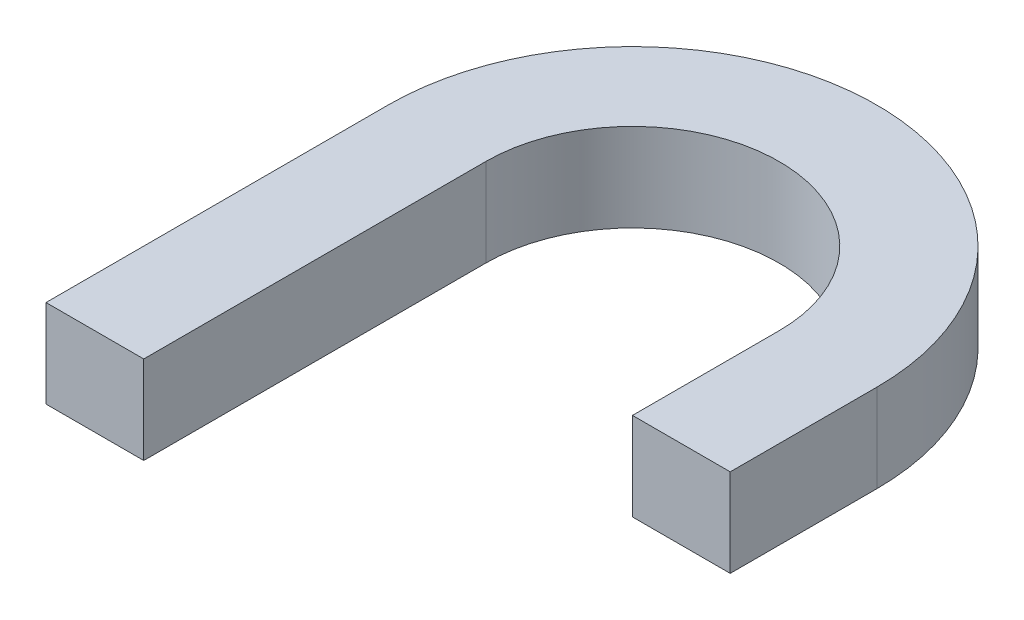
ISO-10303-21;
HEADER;
FILE_DESCRIPTION(('STEP AP214'),'2;1');
FILE_NAME('part.step','',(''),(''),'','','');
FILE_SCHEMA(('AUTOMOTIVE_DESIGN { 1 0 10303 214 1 1 1 1 }'));
ENDSEC;
DATA;
#1=APPLICATION_CONTEXT('core data for automotive mechanical design processes');
#2=APPLICATION_PROTOCOL_DEFINITION('international standard','automotive_design',2000,#1);
#3=PRODUCT_CONTEXT('',#1,'mechanical');
#4=PRODUCT('Part','Part','',(#3));
#5=PRODUCT_RELATED_PRODUCT_CATEGORY('part','',(#4));
#6=PRODUCT_DEFINITION_FORMATION('','',#4);
#7=PRODUCT_DEFINITION_CONTEXT('part definition',#1,'design');
#8=PRODUCT_DEFINITION('design','',#6,#7);
#9=PRODUCT_DEFINITION_SHAPE('','',#8);
#10=(LENGTH_UNIT() NAMED_UNIT(*) SI_UNIT(.MILLI.,.METRE.));
#11=(NAMED_UNIT(*) PLANE_ANGLE_UNIT() SI_UNIT($,.RADIAN.));
#12=(NAMED_UNIT(*) SI_UNIT($,.STERADIAN.) SOLID_ANGLE_UNIT());
#13=UNCERTAINTY_MEASURE_WITH_UNIT(LENGTH_MEASURE(1.E-05),#10,'distance_accuracy_value','');
#14=(GEOMETRIC_REPRESENTATION_CONTEXT(3) GLOBAL_UNCERTAINTY_ASSIGNED_CONTEXT((#13)) GLOBAL_UNIT_ASSIGNED_CONTEXT((#10,
#11,#12)) REPRESENTATION_CONTEXT('',''));
#15=CARTESIAN_POINT('',(0.,0.,0.));
#16=DIRECTION('',(0.,0.,1.));
#17=DIRECTION('',(1.,0.,0.));
#18=AXIS2_PLACEMENT_3D('',#15,#16,#17);
#19=CARTESIAN_POINT('',(0.,11.43,0.));
#20=DIRECTION('',(0.,-1.,0.));
#21=DIRECTION('',(0.,0.,-1.));
#22=AXIS2_PLACEMENT_3D('',#19,#20,#21);
#23=CYLINDRICAL_SURFACE('',#22,63.5);
#24=CARTESIAN_POINT('',(0.,-11.43,0.));
#25=DIRECTION('',(0.,1.,0.));
#26=DIRECTION('',(0.,0.,1.));
#27=AXIS2_PLACEMENT_3D('',#24,#25,#26);
#28=CIRCLE('',#27,63.5);
#29=CARTESIAN_POINT('',(63.5,-11.43,0.));
#30=VERTEX_POINT('',#29);
#31=CARTESIAN_POINT('',(-63.5,-11.43,0.));
#32=VERTEX_POINT('',#31);
#33=EDGE_CURVE('E158',#30,#32,#28,.T.);
#34=ORIENTED_EDGE('',*,*,#33,.T.);
#35=DIRECTION('',(0.,-1.,0.));
#36=VECTOR('',#35,1.);
#37=CARTESIAN_POINT('',(-63.5,11.43,0.));
#38=LINE('',#37,#36);
#39=CARTESIAN_POINT('',(-63.5,11.43,0.));
#40=VERTEX_POINT('',#39);
#41=EDGE_CURVE('E11',#40,#32,#38,.T.);
#42=ORIENTED_EDGE('',*,*,#41,.F.);
#43=CARTESIAN_POINT('',(0.,11.43,0.));
#44=DIRECTION('',(0.,1.,0.));
#45=DIRECTION('',(0.,0.,1.));
#46=AXIS2_PLACEMENT_3D('',#43,#44,#45);
#47=CIRCLE('',#46,63.5);
#48=CARTESIAN_POINT('',(63.5,11.43,0.));
#49=VERTEX_POINT('',#48);
#50=EDGE_CURVE('E179',#49,#40,#47,.T.);
#51=ORIENTED_EDGE('',*,*,#50,.F.);
#52=DIRECTION('',(0.,-1.,0.));
#53=VECTOR('',#52,1.);
#54=CARTESIAN_POINT('',(63.5,11.43,0.));
#55=LINE('',#54,#53);
#56=EDGE_CURVE('E154',#49,#30,#55,.T.);
#57=ORIENTED_EDGE('',*,*,#56,.T.);
#58=EDGE_LOOP('',(#34,#42,#51,#57));
#59=FACE_BOUND('',#58,.T.);
#60=ADVANCED_FACE('F40',(#59),#23,.T.);
#61=CARTESIAN_POINT('',(-63.5,11.43,0.));
#62=DIRECTION('',(1.,0.,0.));
#63=DIRECTION('',(0.,0.,-1.));
#64=AXIS2_PLACEMENT_3D('',#61,#62,#63);
#65=PLANE('',#64);
#66=DIRECTION('',(0.,0.,1.));
#67=VECTOR('',#66,1.);
#68=CARTESIAN_POINT('',(-63.5,-11.43,0.));
#69=LINE('',#68,#67);
#70=CARTESIAN_POINT('',(-63.5,-11.43,88.9));
#71=VERTEX_POINT('',#70);
#72=EDGE_CURVE('E162',#32,#71,#69,.T.);
#73=ORIENTED_EDGE('',*,*,#72,.T.);
#74=DIRECTION('',(0.,-1.,0.));
#75=VECTOR('',#74,1.);
#76=CARTESIAN_POINT('',(-63.5,11.43,88.9));
#77=LINE('',#76,#75);
#78=CARTESIAN_POINT('',(-63.5,11.43,88.9));
#79=VERTEX_POINT('',#78);
#80=EDGE_CURVE('E49',#79,#71,#77,.T.);
#81=ORIENTED_EDGE('',*,*,#80,.F.);
#82=DIRECTION('',(0.,0.,1.));
#83=VECTOR('',#82,1.);
#84=CARTESIAN_POINT('',(-63.5,11.43,0.));
#85=LINE('',#84,#83);
#86=EDGE_CURVE('E112',#40,#79,#85,.T.);
#87=ORIENTED_EDGE('',*,*,#86,.F.);
#88=ORIENTED_EDGE('',*,*,#41,.T.);
#89=EDGE_LOOP('',(#73,#81,#87,#88));
#90=FACE_BOUND('',#89,.T.);
#91=ADVANCED_FACE('F225',(#90),#65,.F.);
#92=CARTESIAN_POINT('',(-63.5,11.43,88.9));
#93=DIRECTION('',(0.,0.,-1.));
#94=DIRECTION('',(-1.,0.,0.));
#95=AXIS2_PLACEMENT_3D('',#92,#93,#94);
#96=PLANE('',#95);
#97=DIRECTION('',(1.,0.,0.));
#98=VECTOR('',#97,1.);
#99=CARTESIAN_POINT('',(-63.5,-11.43,88.9));
#100=LINE('',#99,#98);
#101=CARTESIAN_POINT('',(-38.1,-11.43,88.9));
#102=VERTEX_POINT('',#101);
#103=EDGE_CURVE('E165',#71,#102,#100,.T.);
#104=ORIENTED_EDGE('',*,*,#103,.T.);
#105=DIRECTION('',(0.,-1.,0.));
#106=VECTOR('',#105,1.);
#107=CARTESIAN_POINT('',(-38.1,11.43,88.9));
#108=LINE('',#107,#106);
#109=CARTESIAN_POINT('',(-38.1,11.43,88.9));
#110=VERTEX_POINT('',#109);
#111=EDGE_CURVE('E190',#110,#102,#108,.T.);
#112=ORIENTED_EDGE('',*,*,#111,.F.);
#113=DIRECTION('',(1.,0.,0.));
#114=VECTOR('',#113,1.);
#115=CARTESIAN_POINT('',(-63.5,11.43,88.9));
#116=LINE('',#115,#114);
#117=EDGE_CURVE('E200',#79,#110,#116,.T.);
#118=ORIENTED_EDGE('',*,*,#117,.F.);
#119=ORIENTED_EDGE('',*,*,#80,.T.);
#120=EDGE_LOOP('',(#104,#112,#118,#119));
#121=FACE_BOUND('',#120,.T.);
#122=ADVANCED_FACE('F198',(#121),#96,.F.);
#123=CARTESIAN_POINT('',(-38.1,11.43,0.));
#124=DIRECTION('',(-1.,0.,0.));
#125=DIRECTION('',(0.,0.,1.));
#126=AXIS2_PLACEMENT_3D('',#123,#124,#125);
#127=PLANE('',#126);
#128=DIRECTION('',(0.,0.,-1.));
#129=VECTOR('',#128,1.);
#130=CARTESIAN_POINT('',(-38.1,-11.43,0.));
#131=LINE('',#130,#129);
#132=CARTESIAN_POINT('',(-38.1,-11.43,0.));
#133=VERTEX_POINT('',#132);
#134=EDGE_CURVE('E168',#102,#133,#131,.T.);
#135=ORIENTED_EDGE('',*,*,#134,.T.);
#136=DIRECTION('',(0.,-1.,0.));
#137=VECTOR('',#136,1.);
#138=CARTESIAN_POINT('',(-38.1,11.43,0.));
#139=LINE('',#138,#137);
#140=CARTESIAN_POINT('',(-38.1,11.43,0.));
#141=VERTEX_POINT('',#140);
#142=EDGE_CURVE('E186',#141,#133,#139,.T.);
#143=ORIENTED_EDGE('',*,*,#142,.F.);
#144=DIRECTION('',(0.,0.,-1.));
#145=VECTOR('',#144,1.);
#146=CARTESIAN_POINT('',(-38.1,11.43,0.));
#147=LINE('',#146,#145);
#148=EDGE_CURVE('E213',#110,#141,#147,.T.);
#149=ORIENTED_EDGE('',*,*,#148,.F.);
#150=ORIENTED_EDGE('',*,*,#111,.T.);
#151=EDGE_LOOP('',(#135,#143,#149,#150));
#152=FACE_BOUND('',#151,.T.);
#153=ADVANCED_FACE('F208',(#152),#127,.F.);
#154=CARTESIAN_POINT('',(0.,11.43,0.));
#155=DIRECTION('',(0.,-1.,0.));
#156=DIRECTION('',(0.,0.,-1.));
#157=AXIS2_PLACEMENT_3D('',#154,#155,#156);
#158=CYLINDRICAL_SURFACE('',#157,38.1);
#159=CARTESIAN_POINT('',(0.,-11.43,0.));
#160=DIRECTION('',(0.,-1.,0.));
#161=DIRECTION('',(0.,0.,1.));
#162=AXIS2_PLACEMENT_3D('',#159,#160,#161);
#163=CIRCLE('',#162,38.1);
#164=CARTESIAN_POINT('',(38.1,-11.43,0.));
#165=VERTEX_POINT('',#164);
#166=EDGE_CURVE('E171',#133,#165,#163,.T.);
#167=ORIENTED_EDGE('',*,*,#166,.T.);
#168=DIRECTION('',(0.,-1.,0.));
#169=VECTOR('',#168,1.);
#170=CARTESIAN_POINT('',(38.1,11.43,0.));
#171=LINE('',#170,#169);
#172=CARTESIAN_POINT('',(38.1,11.43,0.));
#173=VERTEX_POINT('',#172);
#174=EDGE_CURVE('E146',#173,#165,#171,.T.);
#175=ORIENTED_EDGE('',*,*,#174,.F.);
#176=CARTESIAN_POINT('',(0.,11.43,0.));
#177=DIRECTION('',(0.,-1.,0.));
#178=DIRECTION('',(0.,0.,1.));
#179=AXIS2_PLACEMENT_3D('',#176,#177,#178);
#180=CIRCLE('',#179,38.1);
#181=EDGE_CURVE('E135',#141,#173,#180,.T.);
#182=ORIENTED_EDGE('',*,*,#181,.F.);
#183=ORIENTED_EDGE('',*,*,#142,.T.);
#184=EDGE_LOOP('',(#167,#175,#182,#183));
#185=FACE_BOUND('',#184,.T.);
#186=ADVANCED_FACE('F211',(#185),#158,.F.);
#187=CARTESIAN_POINT('',(38.1,11.43,38.1));
#188=DIRECTION('',(1.,0.,0.));
#189=DIRECTION('',(0.,0.,-1.));
#190=AXIS2_PLACEMENT_3D('',#187,#188,#189);
#191=PLANE('',#190);
#192=DIRECTION('',(0.,0.,1.));
#193=VECTOR('',#192,1.);
#194=CARTESIAN_POINT('',(38.1,-11.43,38.1));
#195=LINE('',#194,#193);
#196=CARTESIAN_POINT('',(38.1,-11.43,38.1));
#197=VERTEX_POINT('',#196);
#198=EDGE_CURVE('E144',#165,#197,#195,.T.);
#199=ORIENTED_EDGE('',*,*,#198,.T.);
#200=DIRECTION('',(0.,-1.,0.));
#201=VECTOR('',#200,1.);
#202=CARTESIAN_POINT('',(38.1,11.43,38.1));
#203=LINE('',#202,#201);
#204=CARTESIAN_POINT('',(38.1,11.43,38.1));
#205=VERTEX_POINT('',#204);
#206=EDGE_CURVE('E141',#205,#197,#203,.T.);
#207=ORIENTED_EDGE('',*,*,#206,.F.);
#208=DIRECTION('',(0.,0.,1.));
#209=VECTOR('',#208,1.);
#210=CARTESIAN_POINT('',(38.1,11.43,38.1));
#211=LINE('',#210,#209);
#212=EDGE_CURVE('E129',#173,#205,#211,.T.);
#213=ORIENTED_EDGE('',*,*,#212,.F.);
#214=ORIENTED_EDGE('',*,*,#174,.T.);
#215=EDGE_LOOP('',(#199,#207,#213,#214));
#216=FACE_BOUND('',#215,.T.);
#217=ADVANCED_FACE('F142',(#216),#191,.F.);
#218=CARTESIAN_POINT('',(38.1,11.43,38.1));
#219=DIRECTION('',(0.,0.,-1.));
#220=DIRECTION('',(-1.,0.,0.));
#221=AXIS2_PLACEMENT_3D('',#218,#219,#220);
#222=PLANE('',#221);
#223=DIRECTION('',(1.,0.,0.));
#224=VECTOR('',#223,1.);
#225=CARTESIAN_POINT('',(38.1,-11.43,38.1));
#226=LINE('',#225,#224);
#227=CARTESIAN_POINT('',(63.5,-11.43,38.1));
#228=VERTEX_POINT('',#227);
#229=EDGE_CURVE('E96',#197,#228,#226,.T.);
#230=ORIENTED_EDGE('',*,*,#229,.T.);
#231=DIRECTION('',(0.,-1.,0.));
#232=VECTOR('',#231,1.);
#233=CARTESIAN_POINT('',(63.5,11.43,38.1));
#234=LINE('',#233,#232);
#235=CARTESIAN_POINT('',(63.5,11.43,38.1));
#236=VERTEX_POINT('',#235);
#237=EDGE_CURVE('E147',#236,#228,#234,.T.);
#238=ORIENTED_EDGE('',*,*,#237,.F.);
#239=DIRECTION('',(1.,0.,0.));
#240=VECTOR('',#239,1.);
#241=CARTESIAN_POINT('',(38.1,11.43,38.1));
#242=LINE('',#241,#240);
#243=EDGE_CURVE('E133',#205,#236,#242,.T.);
#244=ORIENTED_EDGE('',*,*,#243,.F.);
#245=ORIENTED_EDGE('',*,*,#206,.T.);
#246=EDGE_LOOP('',(#230,#238,#244,#245));
#247=FACE_BOUND('',#246,.T.);
#248=ADVANCED_FACE('F149',(#247),#222,.F.);
#249=CARTESIAN_POINT('',(63.5,11.43,38.1));
#250=DIRECTION('',(-1.,0.,0.));
#251=DIRECTION('',(0.,0.,1.));
#252=AXIS2_PLACEMENT_3D('',#249,#250,#251);
#253=PLANE('',#252);
#254=DIRECTION('',(0.,0.,-1.));
#255=VECTOR('',#254,1.);
#256=CARTESIAN_POINT('',(63.5,-11.43,38.1));
#257=LINE('',#256,#255);
#258=EDGE_CURVE('E102',#228,#30,#257,.T.);
#259=ORIENTED_EDGE('',*,*,#258,.T.);
#260=ORIENTED_EDGE('',*,*,#56,.F.);
#261=DIRECTION('',(0.,0.,-1.));
#262=VECTOR('',#261,1.);
#263=CARTESIAN_POINT('',(63.5,11.43,38.1));
#264=LINE('',#263,#262);
#265=EDGE_CURVE('E60',#236,#49,#264,.T.);
#266=ORIENTED_EDGE('',*,*,#265,.F.);
#267=ORIENTED_EDGE('',*,*,#237,.T.);
#268=EDGE_LOOP('',(#259,#260,#266,#267));
#269=FACE_BOUND('',#268,.T.);
#270=ADVANCED_FACE('F241',(#269),#253,.F.);
#271=CARTESIAN_POINT('',(0.,11.43,0.));
#272=DIRECTION('',(0.,1.,0.));
#273=DIRECTION('',(0.,0.,1.));
#274=AXIS2_PLACEMENT_3D('',#271,#272,#273);
#275=PLANE('',#274);
#276=ORIENTED_EDGE('',*,*,#50,.T.);
#277=ORIENTED_EDGE('',*,*,#86,.T.);
#278=ORIENTED_EDGE('',*,*,#117,.T.);
#279=ORIENTED_EDGE('',*,*,#148,.T.);
#280=ORIENTED_EDGE('',*,*,#181,.T.);
#281=ORIENTED_EDGE('',*,*,#212,.T.);
#282=ORIENTED_EDGE('',*,*,#243,.T.);
#283=ORIENTED_EDGE('',*,*,#265,.T.);
#284=EDGE_LOOP('',(#276,#277,#278,#279,#280,#281,#282,#283));
#285=FACE_BOUND('',#284,.T.);
#286=ADVANCED_FACE('F131',(#285),#275,.T.);
#287=CARTESIAN_POINT('',(0.,-11.43,0.));
#288=DIRECTION('',(0.,1.,0.));
#289=DIRECTION('',(0.,0.,1.));
#290=AXIS2_PLACEMENT_3D('',#287,#288,#289);
#291=PLANE('',#290);
#292=ORIENTED_EDGE('',*,*,#33,.F.);
#293=ORIENTED_EDGE('',*,*,#258,.F.);
#294=ORIENTED_EDGE('',*,*,#229,.F.);
#295=ORIENTED_EDGE('',*,*,#198,.F.);
#296=ORIENTED_EDGE('',*,*,#166,.F.);
#297=ORIENTED_EDGE('',*,*,#134,.F.);
#298=ORIENTED_EDGE('',*,*,#103,.F.);
#299=ORIENTED_EDGE('',*,*,#72,.F.);
#300=EDGE_LOOP('',(#292,#293,#294,#295,#296,#297,#298,#299));
#301=FACE_BOUND('',#300,.T.);
#302=ADVANCED_FACE('F204',(#301),#291,.F.);
#303=CLOSED_SHELL('',(#60,#91,#122,#153,#186,#217,#248,#270,#286,#302));
#304=MANIFOLD_SOLID_BREP('B2',#303);
#305=ADVANCED_BREP_SHAPE_REPRESENTATION('',(#18,#304),#14);
#306=SHAPE_DEFINITION_REPRESENTATION(#9,#305);
ENDSEC;
END-ISO-10303-21;
